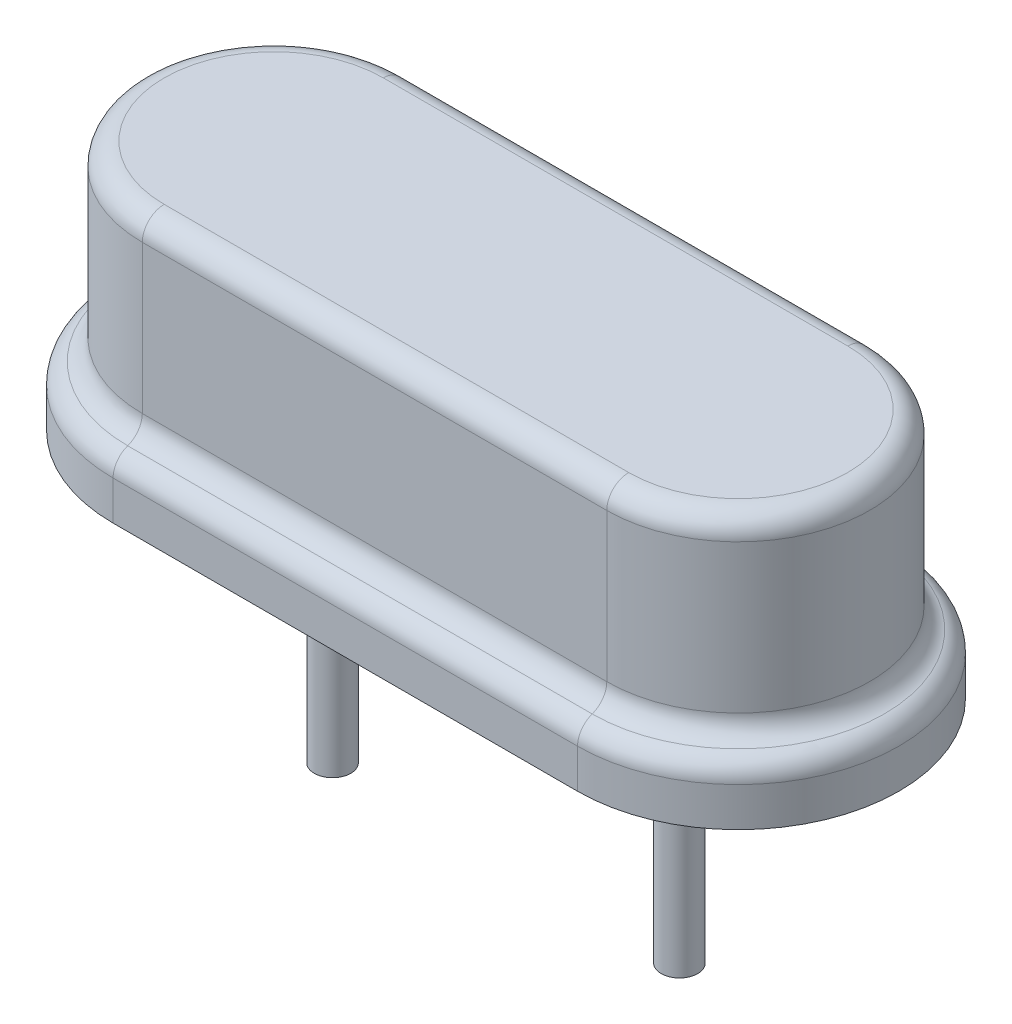
ISO-10303-21;
HEADER;
FILE_DESCRIPTION(('STEP AP214'),'2;1');
FILE_NAME('part.step','',(''),(''),'','','');
FILE_SCHEMA(('AUTOMOTIVE_DESIGN { 1 0 10303 214 1 1 1 1 }'));
ENDSEC;
DATA;
#1=APPLICATION_CONTEXT('core data for automotive mechanical design processes');
#2=APPLICATION_PROTOCOL_DEFINITION('international standard','automotive_design',2000,#1);
#3=PRODUCT_CONTEXT('',#1,'mechanical');
#4=PRODUCT('Part','Part','',(#3));
#5=PRODUCT_RELATED_PRODUCT_CATEGORY('part','',(#4));
#6=PRODUCT_DEFINITION_FORMATION('','',#4);
#7=PRODUCT_DEFINITION_CONTEXT('part definition',#1,'design');
#8=PRODUCT_DEFINITION('design','',#6,#7);
#9=PRODUCT_DEFINITION_SHAPE('','',#8);
#10=(LENGTH_UNIT() NAMED_UNIT(*) SI_UNIT(.MILLI.,.METRE.));
#11=(NAMED_UNIT(*) PLANE_ANGLE_UNIT() SI_UNIT($,.RADIAN.));
#12=(NAMED_UNIT(*) SI_UNIT($,.STERADIAN.) SOLID_ANGLE_UNIT());
#13=UNCERTAINTY_MEASURE_WITH_UNIT(LENGTH_MEASURE(1.E-05),#10,'distance_accuracy_value','');
#14=(GEOMETRIC_REPRESENTATION_CONTEXT(3) GLOBAL_UNCERTAINTY_ASSIGNED_CONTEXT((#13)) GLOBAL_UNIT_ASSIGNED_CONTEXT((#10,
#11,#12)) REPRESENTATION_CONTEXT('',''));
#15=CARTESIAN_POINT('',(0.,0.,0.));
#16=DIRECTION('',(0.,0.,1.));
#17=DIRECTION('',(1.,0.,0.));
#18=AXIS2_PLACEMENT_3D('',#15,#16,#17);
#19=CARTESIAN_POINT('',(0.,3.43,-2.2));
#20=DIRECTION('',(0.,-1.,0.));
#21=DIRECTION('',(0.,0.,-1.));
#22=AXIS2_PLACEMENT_3D('',#19,#20,#21);
#23=CYLINDRICAL_SURFACE('',#22,1.8);
#24=DIRECTION('',(0.,-1.,0.));
#25=VECTOR('',#24,1.);
#26=CARTESIAN_POINT('',(0.,3.43,-4.));
#27=LINE('',#26,#25);
#28=CARTESIAN_POINT('',(0.,3.13,-4.));
#29=VERTEX_POINT('',#28);
#30=CARTESIAN_POINT('',(0.,1.1,-4.));
#31=VERTEX_POINT('',#30);
#32=EDGE_CURVE('E139',#29,#31,#27,.T.);
#33=ORIENTED_EDGE('',*,*,#32,.T.);
#34=CARTESIAN_POINT('',(0.,1.1,-2.2));
#35=DIRECTION('',(0.,1.,0.));
#36=DIRECTION('',(0.,0.,1.));
#37=AXIS2_PLACEMENT_3D('',#34,#35,#36);
#38=CIRCLE('',#37,1.8);
#39=CARTESIAN_POINT('',(0.,1.1,-0.4));
#40=VERTEX_POINT('',#39);
#41=EDGE_CURVE('E183',#31,#40,#38,.T.);
#42=ORIENTED_EDGE('',*,*,#41,.T.);
#43=DIRECTION('',(0.,-1.,0.));
#44=VECTOR('',#43,1.);
#45=CARTESIAN_POINT('',(0.,3.43,-0.4));
#46=LINE('',#45,#44);
#47=CARTESIAN_POINT('',(0.,3.13,-0.4));
#48=VERTEX_POINT('',#47);
#49=EDGE_CURVE('E178',#48,#40,#46,.T.);
#50=ORIENTED_EDGE('',*,*,#49,.F.);
#51=CARTESIAN_POINT('',(0.,3.13,-2.2));
#52=DIRECTION('',(0.,1.,0.));
#53=DIRECTION('',(0.,0.,1.));
#54=AXIS2_PLACEMENT_3D('',#51,#52,#53);
#55=CIRCLE('',#54,1.8);
#56=EDGE_CURVE('E181',#48,#29,#55,.F.);
#57=ORIENTED_EDGE('',*,*,#56,.T.);
#58=EDGE_LOOP('',(#33,#42,#50,#57));
#59=FACE_BOUND('',#58,.T.);
#60=ADVANCED_FACE('F37',(#59),#23,.T.);
#61=CARTESIAN_POINT('',(0.,3.43,-0.4));
#62=DIRECTION('',(0.,0.,-1.));
#63=DIRECTION('',(-1.,0.,0.));
#64=AXIS2_PLACEMENT_3D('',#61,#62,#63);
#65=PLANE('',#64);
#66=ORIENTED_EDGE('',*,*,#49,.T.);
#67=DIRECTION('',(1.,0.,0.));
#68=VECTOR('',#67,1.);
#69=CARTESIAN_POINT('',(0.,1.1,-0.4));
#70=LINE('',#69,#68);
#71=CARTESIAN_POINT('',(6.36,1.1,-0.4));
#72=VERTEX_POINT('',#71);
#73=EDGE_CURVE('E197',#40,#72,#70,.T.);
#74=ORIENTED_EDGE('',*,*,#73,.T.);
#75=DIRECTION('',(0.,-1.,0.));
#76=VECTOR('',#75,1.);
#77=CARTESIAN_POINT('',(6.36,3.43,-0.4));
#78=LINE('',#77,#76);
#79=CARTESIAN_POINT('',(6.36,3.13,-0.4));
#80=VERTEX_POINT('',#79);
#81=EDGE_CURVE('E175',#80,#72,#78,.T.);
#82=ORIENTED_EDGE('',*,*,#81,.F.);
#83=DIRECTION('',(1.,0.,0.));
#84=VECTOR('',#83,1.);
#85=CARTESIAN_POINT('',(0.,3.13,-0.4));
#86=LINE('',#85,#84);
#87=EDGE_CURVE('E194',#80,#48,#86,.F.);
#88=ORIENTED_EDGE('',*,*,#87,.T.);
#89=EDGE_LOOP('',(#66,#74,#82,#88));
#90=FACE_BOUND('',#89,.T.);
#91=ADVANCED_FACE('F272',(#90),#65,.F.);
#92=CARTESIAN_POINT('',(6.36,3.43,-2.2));
#93=DIRECTION('',(0.,-1.,0.));
#94=DIRECTION('',(0.,0.,-1.));
#95=AXIS2_PLACEMENT_3D('',#92,#93,#94);
#96=CYLINDRICAL_SURFACE('',#95,1.8);
#97=ORIENTED_EDGE('',*,*,#81,.T.);
#98=CARTESIAN_POINT('',(6.36,1.1,-2.2));
#99=DIRECTION('',(0.,1.,0.));
#100=DIRECTION('',(0.,0.,1.));
#101=AXIS2_PLACEMENT_3D('',#98,#99,#100);
#102=CIRCLE('',#101,1.8);
#103=CARTESIAN_POINT('',(6.36,1.1,-4.));
#104=VERTEX_POINT('',#103);
#105=EDGE_CURVE('E192',#72,#104,#102,.T.);
#106=ORIENTED_EDGE('',*,*,#105,.T.);
#107=DIRECTION('',(0.,-1.,0.));
#108=VECTOR('',#107,1.);
#109=CARTESIAN_POINT('',(6.36,3.43,-4.));
#110=LINE('',#109,#108);
#111=CARTESIAN_POINT('',(6.36,3.13,-4.));
#112=VERTEX_POINT('',#111);
#113=EDGE_CURVE('E172',#112,#104,#110,.T.);
#114=ORIENTED_EDGE('',*,*,#113,.F.);
#115=CARTESIAN_POINT('',(6.36,3.13,-2.2));
#116=DIRECTION('',(0.,1.,0.));
#117=DIRECTION('',(0.,0.,1.));
#118=AXIS2_PLACEMENT_3D('',#115,#116,#117);
#119=CIRCLE('',#118,1.8);
#120=EDGE_CURVE('E190',#112,#80,#119,.F.);
#121=ORIENTED_EDGE('',*,*,#120,.T.);
#122=EDGE_LOOP('',(#97,#106,#114,#121));
#123=FACE_BOUND('',#122,.T.);
#124=ADVANCED_FACE('F278',(#123),#96,.T.);
#125=CARTESIAN_POINT('',(6.36,3.43,-4.));
#126=DIRECTION('',(0.,0.,1.));
#127=DIRECTION('',(1.,0.,0.));
#128=AXIS2_PLACEMENT_3D('',#125,#126,#127);
#129=PLANE('',#128);
#130=ORIENTED_EDGE('',*,*,#113,.T.);
#131=DIRECTION('',(-1.,0.,0.));
#132=VECTOR('',#131,1.);
#133=CARTESIAN_POINT('',(6.36,1.1,-4.));
#134=LINE('',#133,#132);
#135=EDGE_CURVE('E188',#104,#31,#134,.T.);
#136=ORIENTED_EDGE('',*,*,#135,.T.);
#137=ORIENTED_EDGE('',*,*,#32,.F.);
#138=DIRECTION('',(-1.,0.,0.));
#139=VECTOR('',#138,1.);
#140=CARTESIAN_POINT('',(6.36,3.13,-4.));
#141=LINE('',#140,#139);
#142=EDGE_CURVE('E186',#29,#112,#141,.F.);
#143=ORIENTED_EDGE('',*,*,#142,.T.);
#144=EDGE_LOOP('',(#130,#136,#137,#143));
#145=FACE_BOUND('',#144,.T.);
#146=ADVANCED_FACE('F342',(#145),#129,.F.);
#147=CARTESIAN_POINT('',(0.,3.43,-2.2));
#148=DIRECTION('',(0.,1.,0.));
#149=DIRECTION('',(0.,0.,1.));
#150=AXIS2_PLACEMENT_3D('',#147,#148,#149);
#151=PLANE('',#150);
#152=CARTESIAN_POINT('',(0.,3.43,-2.2));
#153=DIRECTION('',(0.,1.,0.));
#154=DIRECTION('',(0.,0.,1.));
#155=AXIS2_PLACEMENT_3D('',#152,#153,#154);
#156=CIRCLE('',#155,1.5);
#157=CARTESIAN_POINT('',(0.,3.43,-3.7));
#158=VERTEX_POINT('',#157);
#159=CARTESIAN_POINT('',(0.,3.43,-0.7));
#160=VERTEX_POINT('',#159);
#161=EDGE_CURVE('E200',#158,#160,#156,.T.);
#162=ORIENTED_EDGE('',*,*,#161,.T.);
#163=DIRECTION('',(1.,0.,0.));
#164=VECTOR('',#163,1.);
#165=CARTESIAN_POINT('',(6.36,3.43,-0.7));
#166=LINE('',#165,#164);
#167=CARTESIAN_POINT('',(6.36,3.43,-0.700000000000001));
#168=VERTEX_POINT('',#167);
#169=EDGE_CURVE('E206',#160,#168,#166,.T.);
#170=ORIENTED_EDGE('',*,*,#169,.T.);
#171=CARTESIAN_POINT('',(6.36,3.43,-2.2));
#172=DIRECTION('',(0.,1.,0.));
#173=DIRECTION('',(0.,0.,1.));
#174=AXIS2_PLACEMENT_3D('',#171,#172,#173);
#175=CIRCLE('',#174,1.5);
#176=CARTESIAN_POINT('',(6.36,3.43,-3.7));
#177=VERTEX_POINT('',#176);
#178=EDGE_CURVE('E204',#168,#177,#175,.T.);
#179=ORIENTED_EDGE('',*,*,#178,.T.);
#180=DIRECTION('',(-1.,0.,0.));
#181=VECTOR('',#180,1.);
#182=CARTESIAN_POINT('',(0.,3.43,-3.7));
#183=LINE('',#182,#181);
#184=EDGE_CURVE('E202',#177,#158,#183,.T.);
#185=ORIENTED_EDGE('',*,*,#184,.T.);
#186=EDGE_LOOP('',(#162,#170,#179,#185));
#187=FACE_BOUND('',#186,.T.);
#188=ADVANCED_FACE('F340',(#187),#151,.T.);
#189=CARTESIAN_POINT('',(0.,0.8,-2.2));
#190=DIRECTION('',(0.,-1.,0.));
#191=DIRECTION('',(0.,0.,-1.));
#192=AXIS2_PLACEMENT_3D('',#189,#190,#191);
#193=CYLINDRICAL_SURFACE('',#192,2.2);
#194=DIRECTION('',(0.,-1.,0.));
#195=VECTOR('',#194,1.);
#196=CARTESIAN_POINT('',(0.,0.8,0.));
#197=LINE('',#196,#195);
#198=CARTESIAN_POINT('',(0.,0.534314575050762,0.));
#199=VERTEX_POINT('',#198);
#200=CARTESIAN_POINT('',(0.,0.,0.));
#201=VERTEX_POINT('',#200);
#202=EDGE_CURVE('E128',#199,#201,#197,.T.);
#203=ORIENTED_EDGE('',*,*,#202,.F.);
#204=CARTESIAN_POINT('',(0.,0.534314575050762,-2.2));
#205=DIRECTION('',(0.,-1.,0.));
#206=DIRECTION('',(0.,0.,-1.));
#207=AXIS2_PLACEMENT_3D('',#204,#205,#206);
#208=CIRCLE('',#207,2.2);
#209=CARTESIAN_POINT('',(0.,0.534314575050762,-4.4));
#210=VERTEX_POINT('',#209);
#211=EDGE_CURVE('E229',#199,#210,#208,.T.);
#212=ORIENTED_EDGE('',*,*,#211,.T.);
#213=DIRECTION('',(0.,-1.,0.));
#214=VECTOR('',#213,1.);
#215=CARTESIAN_POINT('',(0.,0.8,-4.4));
#216=LINE('',#215,#214);
#217=CARTESIAN_POINT('',(0.,0.,-4.4));
#218=VERTEX_POINT('',#217);
#219=EDGE_CURVE('E152',#210,#218,#216,.T.);
#220=ORIENTED_EDGE('',*,*,#219,.T.);
#221=CARTESIAN_POINT('',(0.,0.,-2.2));
#222=DIRECTION('',(0.,1.,0.));
#223=DIRECTION('',(0.,0.,1.));
#224=AXIS2_PLACEMENT_3D('',#221,#222,#223);
#225=CIRCLE('',#224,2.2);
#226=EDGE_CURVE('E146',#218,#201,#225,.T.);
#227=ORIENTED_EDGE('',*,*,#226,.T.);
#228=EDGE_LOOP('',(#203,#212,#220,#227));
#229=FACE_BOUND('',#228,.T.);
#230=ADVANCED_FACE('F150',(#229),#193,.T.);
#231=CARTESIAN_POINT('',(0.,0.8,0.));
#232=DIRECTION('',(0.,0.,-1.));
#233=DIRECTION('',(-1.,0.,0.));
#234=AXIS2_PLACEMENT_3D('',#231,#232,#233);
#235=PLANE('',#234);
#236=DIRECTION('',(0.,-1.,0.));
#237=VECTOR('',#236,1.);
#238=CARTESIAN_POINT('',(6.36,0.8,0.));
#239=LINE('',#238,#237);
#240=CARTESIAN_POINT('',(6.36,0.534314575050762,0.));
#241=VERTEX_POINT('',#240);
#242=CARTESIAN_POINT('',(6.36,0.,0.));
#243=VERTEX_POINT('',#242);
#244=EDGE_CURVE('E140',#241,#243,#239,.T.);
#245=ORIENTED_EDGE('',*,*,#244,.F.);
#246=DIRECTION('',(1.,0.,0.));
#247=VECTOR('',#246,1.);
#248=CARTESIAN_POINT('',(0.,0.534314575050762,0.));
#249=LINE('',#248,#247);
#250=EDGE_CURVE('E134',#241,#199,#249,.F.);
#251=ORIENTED_EDGE('',*,*,#250,.T.);
#252=ORIENTED_EDGE('',*,*,#202,.T.);
#253=DIRECTION('',(1.,0.,0.));
#254=VECTOR('',#253,1.);
#255=CARTESIAN_POINT('',(0.,0.,0.));
#256=LINE('',#255,#254);
#257=EDGE_CURVE('E131',#201,#243,#256,.T.);
#258=ORIENTED_EDGE('',*,*,#257,.T.);
#259=EDGE_LOOP('',(#245,#251,#252,#258));
#260=FACE_BOUND('',#259,.T.);
#261=ADVANCED_FACE('F130',(#260),#235,.F.);
#262=CARTESIAN_POINT('',(6.36,0.8,-2.2));
#263=DIRECTION('',(0.,-1.,0.));
#264=DIRECTION('',(0.,0.,-1.));
#265=AXIS2_PLACEMENT_3D('',#262,#263,#264);
#266=CYLINDRICAL_SURFACE('',#265,2.2);
#267=DIRECTION('',(0.,-1.,0.));
#268=VECTOR('',#267,1.);
#269=CARTESIAN_POINT('',(6.36,0.8,-4.4));
#270=LINE('',#269,#268);
#271=CARTESIAN_POINT('',(6.36,0.534314575050762,-4.4));
#272=VERTEX_POINT('',#271);
#273=CARTESIAN_POINT('',(6.36,0.,-4.4));
#274=VERTEX_POINT('',#273);
#275=EDGE_CURVE('E167',#272,#274,#270,.T.);
#276=ORIENTED_EDGE('',*,*,#275,.F.);
#277=CARTESIAN_POINT('',(6.36,0.534314575050762,-2.2));
#278=DIRECTION('',(0.,-1.,0.));
#279=DIRECTION('',(0.,0.,-1.));
#280=AXIS2_PLACEMENT_3D('',#277,#278,#279);
#281=CIRCLE('',#280,2.2);
#282=EDGE_CURVE('E52',#272,#241,#281,.T.);
#283=ORIENTED_EDGE('',*,*,#282,.T.);
#284=ORIENTED_EDGE('',*,*,#244,.T.);
#285=CARTESIAN_POINT('',(6.36,0.,-2.2));
#286=DIRECTION('',(0.,1.,0.));
#287=DIRECTION('',(0.,0.,-1.));
#288=AXIS2_PLACEMENT_3D('',#285,#286,#287);
#289=CIRCLE('',#288,2.2);
#290=EDGE_CURVE('E148',#243,#274,#289,.T.);
#291=ORIENTED_EDGE('',*,*,#290,.T.);
#292=EDGE_LOOP('',(#276,#283,#284,#291));
#293=FACE_BOUND('',#292,.T.);
#294=ADVANCED_FACE('F265',(#293),#266,.T.);
#295=CARTESIAN_POINT('',(6.36,0.8,-4.4));
#296=DIRECTION('',(0.,0.,1.));
#297=DIRECTION('',(1.,0.,0.));
#298=AXIS2_PLACEMENT_3D('',#295,#296,#297);
#299=PLANE('',#298);
#300=ORIENTED_EDGE('',*,*,#219,.F.);
#301=DIRECTION('',(-1.,0.,0.));
#302=VECTOR('',#301,1.);
#303=CARTESIAN_POINT('',(6.36,0.534314575050762,-4.4));
#304=LINE('',#303,#302);
#305=EDGE_CURVE('E233',#210,#272,#304,.F.);
#306=ORIENTED_EDGE('',*,*,#305,.T.);
#307=ORIENTED_EDGE('',*,*,#275,.T.);
#308=DIRECTION('',(-1.,0.,0.));
#309=VECTOR('',#308,1.);
#310=CARTESIAN_POINT('',(6.36,0.,-4.4));
#311=LINE('',#310,#309);
#312=EDGE_CURVE('E164',#274,#218,#311,.T.);
#313=ORIENTED_EDGE('',*,*,#312,.T.);
#314=EDGE_LOOP('',(#300,#306,#307,#313));
#315=FACE_BOUND('',#314,.T.);
#316=ADVANCED_FACE('F255',(#315),#299,.F.);
#317=CARTESIAN_POINT('',(0.,0.,-2.2));
#318=DIRECTION('',(0.,1.,0.));
#319=DIRECTION('',(0.,0.,1.));
#320=AXIS2_PLACEMENT_3D('',#317,#318,#319);
#321=PLANE('',#320);
#322=CARTESIAN_POINT('',(5.555,0.,-2.2));
#323=DIRECTION('',(0.,1.,0.));
#324=DIRECTION('',(0.,0.,1.));
#325=AXIS2_PLACEMENT_3D('',#322,#323,#324);
#326=CIRCLE('',#325,0.25);
#327=CARTESIAN_POINT('',(5.555,0.,-1.95));
#328=VERTEX_POINT('',#327);
#329=EDGE_CURVE('E11',#328,#328,#326,.F.);
#330=ORIENTED_EDGE('',*,*,#329,.F.);
#331=EDGE_LOOP('',(#330));
#332=FACE_BOUND('',#331,.T.);
#333=CARTESIAN_POINT('',(0.805,0.,-2.2));
#334=DIRECTION('',(0.,1.,0.));
#335=DIRECTION('',(0.,0.,1.));
#336=AXIS2_PLACEMENT_3D('',#333,#334,#335);
#337=CIRCLE('',#336,0.25);
#338=CARTESIAN_POINT('',(0.805,0.,-1.95));
#339=VERTEX_POINT('',#338);
#340=EDGE_CURVE('E45',#339,#339,#337,.F.);
#341=ORIENTED_EDGE('',*,*,#340,.F.);
#342=EDGE_LOOP('',(#341));
#343=FACE_BOUND('',#342,.T.);
#344=ORIENTED_EDGE('',*,*,#226,.F.);
#345=ORIENTED_EDGE('',*,*,#312,.F.);
#346=ORIENTED_EDGE('',*,*,#290,.F.);
#347=ORIENTED_EDGE('',*,*,#257,.F.);
#348=EDGE_LOOP('',(#344,#345,#346,#347));
#349=FACE_BOUND('',#348,.T.);
#350=ADVANCED_FACE('F144',(#332,#343,#349),#321,.F.);
#351=CARTESIAN_POINT('',(6.36,1.1,-2.2));
#352=DIRECTION('',(0.,1.,0.));
#353=DIRECTION('',(0.,0.,1.));
#354=AXIS2_PLACEMENT_3D('',#351,#352,#353);
#355=TOROIDAL_SURFACE('',#354,2.1,0.3);
#356=CARTESIAN_POINT('',(6.36,1.1,-0.100000000000001));
#357=DIRECTION('',(1.,0.,0.));
#358=DIRECTION('',(0.,0.,-1.));
#359=AXIS2_PLACEMENT_3D('',#356,#357,#358);
#360=CIRCLE('',#359,0.3);
#361=CARTESIAN_POINT('',(6.36,0.817157287525381,-0.2));
#362=VERTEX_POINT('',#361);
#363=EDGE_CURVE('E157',#362,#72,#360,.T.);
#364=ORIENTED_EDGE('',*,*,#363,.F.);
#365=CARTESIAN_POINT('',(6.36,0.817157287525339,-2.2));
#366=DIRECTION('',(0.,1.,0.));
#367=DIRECTION('',(0.,0.,1.));
#368=AXIS2_PLACEMENT_3D('',#365,#366,#367);
#369=CIRCLE('',#368,1.99999999999998);
#370=CARTESIAN_POINT('',(6.36,0.817157287525339,-4.20000000000005));
#371=VERTEX_POINT('',#370);
#372=EDGE_CURVE('E235',#362,#371,#369,.T.);
#373=ORIENTED_EDGE('',*,*,#372,.T.);
#374=CARTESIAN_POINT('',(6.36,1.1,-4.3));
#375=DIRECTION('',(1.,0.,0.));
#376=DIRECTION('',(0.,0.,-1.));
#377=AXIS2_PLACEMENT_3D('',#374,#375,#376);
#378=CIRCLE('',#377,0.3);
#379=EDGE_CURVE('E154',#104,#371,#378,.T.);
#380=ORIENTED_EDGE('',*,*,#379,.F.);
#381=ORIENTED_EDGE('',*,*,#105,.F.);
#382=EDGE_LOOP('',(#364,#373,#380,#381));
#383=FACE_BOUND('',#382,.T.);
#384=ADVANCED_FACE('F254',(#383),#355,.F.);
#385=CARTESIAN_POINT('',(6.36,1.1,-4.3));
#386=DIRECTION('',(-1.,0.,0.));
#387=DIRECTION('',(0.,0.,1.));
#388=AXIS2_PLACEMENT_3D('',#385,#386,#387);
#389=CYLINDRICAL_SURFACE('',#388,0.3);
#390=ORIENTED_EDGE('',*,*,#379,.T.);
#391=DIRECTION('',(-1.,0.,0.));
#392=VECTOR('',#391,1.);
#393=CARTESIAN_POINT('',(6.36,0.817157287525381,-4.2));
#394=LINE('',#393,#392);
#395=CARTESIAN_POINT('',(0.,0.817157287525381,-4.2));
#396=VERTEX_POINT('',#395);
#397=EDGE_CURVE('E231',#371,#396,#394,.T.);
#398=ORIENTED_EDGE('',*,*,#397,.T.);
#399=CARTESIAN_POINT('',(0.,1.1,-4.3));
#400=DIRECTION('',(1.,0.,0.));
#401=DIRECTION('',(0.,1.,0.));
#402=AXIS2_PLACEMENT_3D('',#399,#400,#401);
#403=CIRCLE('',#402,0.3);
#404=EDGE_CURVE('E212',#31,#396,#403,.T.);
#405=ORIENTED_EDGE('',*,*,#404,.F.);
#406=ORIENTED_EDGE('',*,*,#135,.F.);
#407=EDGE_LOOP('',(#390,#398,#405,#406));
#408=FACE_BOUND('',#407,.T.);
#409=ADVANCED_FACE('F262',(#408),#389,.F.);
#410=CARTESIAN_POINT('',(0.,1.1,-0.1));
#411=DIRECTION('',(1.,0.,0.));
#412=DIRECTION('',(0.,0.,-1.));
#413=AXIS2_PLACEMENT_3D('',#410,#411,#412);
#414=CYLINDRICAL_SURFACE('',#413,0.3);
#415=CARTESIAN_POINT('',(0.,1.1,-0.1));
#416=DIRECTION('',(1.,0.,0.));
#417=DIRECTION('',(0.,0.,-1.));
#418=AXIS2_PLACEMENT_3D('',#415,#416,#417);
#419=CIRCLE('',#418,0.3);
#420=CARTESIAN_POINT('',(0.,0.817157287525381,-0.2));
#421=VERTEX_POINT('',#420);
#422=EDGE_CURVE('E210',#421,#40,#419,.T.);
#423=ORIENTED_EDGE('',*,*,#422,.F.);
#424=DIRECTION('',(1.,0.,0.));
#425=VECTOR('',#424,1.);
#426=CARTESIAN_POINT('',(0.,0.817157287525381,-0.2));
#427=LINE('',#426,#425);
#428=EDGE_CURVE('E60',#421,#362,#427,.T.);
#429=ORIENTED_EDGE('',*,*,#428,.T.);
#430=ORIENTED_EDGE('',*,*,#363,.T.);
#431=ORIENTED_EDGE('',*,*,#73,.F.);
#432=EDGE_LOOP('',(#423,#429,#430,#431));
#433=FACE_BOUND('',#432,.T.);
#434=ADVANCED_FACE('F287',(#433),#414,.F.);
#435=CARTESIAN_POINT('',(0.,1.1,-2.2));
#436=DIRECTION('',(0.,1.,0.));
#437=DIRECTION('',(0.,0.,1.));
#438=AXIS2_PLACEMENT_3D('',#435,#436,#437);
#439=TOROIDAL_SURFACE('',#438,2.1,0.3);
#440=ORIENTED_EDGE('',*,*,#404,.T.);
#441=CARTESIAN_POINT('',(0.,0.817157287525392,-2.2));
#442=DIRECTION('',(0.,1.,0.));
#443=DIRECTION('',(0.,0.,1.));
#444=AXIS2_PLACEMENT_3D('',#441,#442,#443);
#445=CIRCLE('',#444,2.);
#446=EDGE_CURVE('E209',#396,#421,#445,.T.);
#447=ORIENTED_EDGE('',*,*,#446,.T.);
#448=ORIENTED_EDGE('',*,*,#422,.T.);
#449=ORIENTED_EDGE('',*,*,#41,.F.);
#450=EDGE_LOOP('',(#440,#447,#448,#449));
#451=FACE_BOUND('',#450,.T.);
#452=ADVANCED_FACE('F283',(#451),#439,.F.);
#453=CARTESIAN_POINT('',(0.,3.13,-3.7));
#454=DIRECTION('',(1.,0.,0.));
#455=DIRECTION('',(0.,0.,-1.));
#456=AXIS2_PLACEMENT_3D('',#453,#454,#455);
#457=CYLINDRICAL_SURFACE('',#456,0.3);
#458=CARTESIAN_POINT('',(6.36,3.13,-3.7));
#459=DIRECTION('',(1.,0.,0.));
#460=DIRECTION('',(0.,0.,-1.));
#461=AXIS2_PLACEMENT_3D('',#458,#459,#460);
#462=CIRCLE('',#461,0.3);
#463=EDGE_CURVE('E222',#112,#177,#462,.T.);
#464=ORIENTED_EDGE('',*,*,#463,.F.);
#465=ORIENTED_EDGE('',*,*,#142,.F.);
#466=CARTESIAN_POINT('',(0.,3.13,-3.7));
#467=DIRECTION('',(-1.,0.,0.));
#468=DIRECTION('',(0.,0.,1.));
#469=AXIS2_PLACEMENT_3D('',#466,#467,#468);
#470=CIRCLE('',#469,0.3);
#471=EDGE_CURVE('E213',#158,#29,#470,.T.);
#472=ORIENTED_EDGE('',*,*,#471,.F.);
#473=ORIENTED_EDGE('',*,*,#184,.F.);
#474=EDGE_LOOP('',(#464,#465,#472,#473));
#475=FACE_BOUND('',#474,.T.);
#476=ADVANCED_FACE('F286',(#475),#457,.T.);
#477=CARTESIAN_POINT('',(0.,3.13,-2.2));
#478=DIRECTION('',(0.,1.,0.));
#479=DIRECTION('',(0.,0.,1.));
#480=AXIS2_PLACEMENT_3D('',#477,#478,#479);
#481=TOROIDAL_SURFACE('',#480,1.5,0.3);
#482=ORIENTED_EDGE('',*,*,#471,.T.);
#483=ORIENTED_EDGE('',*,*,#56,.F.);
#484=CARTESIAN_POINT('',(0.,3.13,-0.7));
#485=DIRECTION('',(1.,0.,0.));
#486=DIRECTION('',(0.,0.,-1.));
#487=AXIS2_PLACEMENT_3D('',#484,#485,#486);
#488=CIRCLE('',#487,0.3);
#489=EDGE_CURVE('E219',#160,#48,#488,.T.);
#490=ORIENTED_EDGE('',*,*,#489,.F.);
#491=ORIENTED_EDGE('',*,*,#161,.F.);
#492=EDGE_LOOP('',(#482,#483,#490,#491));
#493=FACE_BOUND('',#492,.T.);
#494=ADVANCED_FACE('F301',(#493),#481,.T.);
#495=CARTESIAN_POINT('',(6.36,3.13,-2.2));
#496=DIRECTION('',(0.,1.,0.));
#497=DIRECTION('',(0.,0.,1.));
#498=AXIS2_PLACEMENT_3D('',#495,#496,#497);
#499=TOROIDAL_SURFACE('',#498,1.5,0.3);
#500=ORIENTED_EDGE('',*,*,#463,.T.);
#501=ORIENTED_EDGE('',*,*,#178,.F.);
#502=CARTESIAN_POINT('',(6.36,3.13,-0.700000000000001));
#503=DIRECTION('',(-1.,0.,0.));
#504=DIRECTION('',(0.,0.,1.));
#505=AXIS2_PLACEMENT_3D('',#502,#503,#504);
#506=CIRCLE('',#505,0.3);
#507=EDGE_CURVE('E217',#80,#168,#506,.T.);
#508=ORIENTED_EDGE('',*,*,#507,.F.);
#509=ORIENTED_EDGE('',*,*,#120,.F.);
#510=EDGE_LOOP('',(#500,#501,#508,#509));
#511=FACE_BOUND('',#510,.T.);
#512=ADVANCED_FACE('F297',(#511),#499,.T.);
#513=CARTESIAN_POINT('',(0.,3.13,-0.7));
#514=DIRECTION('',(-1.,0.,0.));
#515=DIRECTION('',(0.,0.,1.));
#516=AXIS2_PLACEMENT_3D('',#513,#514,#515);
#517=CYLINDRICAL_SURFACE('',#516,0.3);
#518=ORIENTED_EDGE('',*,*,#489,.T.);
#519=ORIENTED_EDGE('',*,*,#87,.F.);
#520=ORIENTED_EDGE('',*,*,#507,.T.);
#521=ORIENTED_EDGE('',*,*,#169,.F.);
#522=EDGE_LOOP('',(#518,#519,#520,#521));
#523=FACE_BOUND('',#522,.T.);
#524=ADVANCED_FACE('F294',(#523),#517,.T.);
#525=CARTESIAN_POINT('',(6.36,0.534314575050762,-2.2));
#526=DIRECTION('',(0.,-1.,0.));
#527=DIRECTION('',(0.,0.,-1.));
#528=AXIS2_PLACEMENT_3D('',#525,#526,#527);
#529=TOROIDAL_SURFACE('',#528,1.9,0.3);
#530=CARTESIAN_POINT('',(6.36,0.534314575050762,-0.300000000000001));
#531=DIRECTION('',(-1.,0.,0.));
#532=DIRECTION('',(0.,0.,1.));
#533=AXIS2_PLACEMENT_3D('',#530,#531,#532);
#534=CIRCLE('',#533,0.3);
#535=EDGE_CURVE('E244',#241,#362,#534,.T.);
#536=ORIENTED_EDGE('',*,*,#535,.F.);
#537=ORIENTED_EDGE('',*,*,#282,.F.);
#538=CARTESIAN_POINT('',(6.36,0.534314575050762,-4.1));
#539=DIRECTION('',(-1.,0.,0.));
#540=DIRECTION('',(0.,0.,1.));
#541=AXIS2_PLACEMENT_3D('',#538,#539,#540);
#542=CIRCLE('',#541,0.3);
#543=EDGE_CURVE('E220',#371,#272,#542,.T.);
#544=ORIENTED_EDGE('',*,*,#543,.F.);
#545=ORIENTED_EDGE('',*,*,#372,.F.);
#546=EDGE_LOOP('',(#536,#537,#544,#545));
#547=FACE_BOUND('',#546,.T.);
#548=ADVANCED_FACE('F39',(#547),#529,.T.);
#549=CARTESIAN_POINT('',(6.36,0.534314575050762,-4.1));
#550=DIRECTION('',(-1.,0.,0.));
#551=DIRECTION('',(0.,0.,1.));
#552=AXIS2_PLACEMENT_3D('',#549,#550,#551);
#553=CYLINDRICAL_SURFACE('',#552,0.3);
#554=ORIENTED_EDGE('',*,*,#543,.T.);
#555=ORIENTED_EDGE('',*,*,#305,.F.);
#556=CARTESIAN_POINT('',(0.,0.534314575050762,-4.1));
#557=DIRECTION('',(-1.,0.,0.));
#558=DIRECTION('',(0.,0.,1.));
#559=AXIS2_PLACEMENT_3D('',#556,#557,#558);
#560=CIRCLE('',#559,0.3);
#561=EDGE_CURVE('E242',#396,#210,#560,.T.);
#562=ORIENTED_EDGE('',*,*,#561,.F.);
#563=ORIENTED_EDGE('',*,*,#397,.F.);
#564=EDGE_LOOP('',(#554,#555,#562,#563));
#565=FACE_BOUND('',#564,.T.);
#566=ADVANCED_FACE('F315',(#565),#553,.T.);
#567=CARTESIAN_POINT('',(0.,0.534314575050762,-0.3));
#568=DIRECTION('',(1.,0.,0.));
#569=DIRECTION('',(0.,0.,-1.));
#570=AXIS2_PLACEMENT_3D('',#567,#568,#569);
#571=CYLINDRICAL_SURFACE('',#570,0.3);
#572=ORIENTED_EDGE('',*,*,#535,.T.);
#573=ORIENTED_EDGE('',*,*,#428,.F.);
#574=CARTESIAN_POINT('',(0.,0.534314575050762,-0.3));
#575=DIRECTION('',(-1.,0.,0.));
#576=DIRECTION('',(0.,0.,1.));
#577=AXIS2_PLACEMENT_3D('',#574,#575,#576);
#578=CIRCLE('',#577,0.3);
#579=EDGE_CURVE('E240',#199,#421,#578,.T.);
#580=ORIENTED_EDGE('',*,*,#579,.F.);
#581=ORIENTED_EDGE('',*,*,#250,.F.);
#582=EDGE_LOOP('',(#572,#573,#580,#581));
#583=FACE_BOUND('',#582,.T.);
#584=ADVANCED_FACE('F312',(#583),#571,.T.);
#585=CARTESIAN_POINT('',(0.,0.534314575050762,-2.2));
#586=DIRECTION('',(0.,-1.,0.));
#587=DIRECTION('',(0.,0.,-1.));
#588=AXIS2_PLACEMENT_3D('',#585,#586,#587);
#589=TOROIDAL_SURFACE('',#588,1.9,0.3);
#590=ORIENTED_EDGE('',*,*,#561,.T.);
#591=ORIENTED_EDGE('',*,*,#211,.F.);
#592=ORIENTED_EDGE('',*,*,#579,.T.);
#593=ORIENTED_EDGE('',*,*,#446,.F.);
#594=EDGE_LOOP('',(#590,#591,#592,#593));
#595=FACE_BOUND('',#594,.T.);
#596=ADVANCED_FACE('F309',(#595),#589,.T.);
#597=CARTESIAN_POINT('',(0.805,-3.54,-2.2));
#598=DIRECTION('',(0.,1.,0.));
#599=DIRECTION('',(0.,0.,1.));
#600=AXIS2_PLACEMENT_3D('',#597,#598,#599);
#601=CYLINDRICAL_SURFACE('',#600,0.25);
#602=CARTESIAN_POINT('',(0.805,-3.54,-2.2));
#603=DIRECTION('',(0.,-1.,0.));
#604=DIRECTION('',(0.,0.,-1.));
#605=AXIS2_PLACEMENT_3D('',#602,#603,#604);
#606=CIRCLE('',#605,0.25);
#607=CARTESIAN_POINT('',(0.805,-3.54,-2.45));
#608=VERTEX_POINT('',#607);
#609=EDGE_CURVE('E160',#608,#608,#606,.T.);
#610=ORIENTED_EDGE('',*,*,#609,.F.);
#611=EDGE_LOOP('',(#610));
#612=FACE_BOUND('',#611,.T.);
#613=ORIENTED_EDGE('',*,*,#340,.T.);
#614=EDGE_LOOP('',(#613));
#615=FACE_BOUND('',#614,.T.);
#616=ADVANCED_FACE('F251',(#612,#615),#601,.T.);
#617=CARTESIAN_POINT('',(0.805,-3.54,-2.2));
#618=DIRECTION('',(0.,-1.,0.));
#619=DIRECTION('',(0.,0.,-1.));
#620=AXIS2_PLACEMENT_3D('',#617,#618,#619);
#621=PLANE('',#620);
#622=ORIENTED_EDGE('',*,*,#609,.T.);
#623=EDGE_LOOP('',(#622));
#624=FACE_BOUND('',#623,.T.);
#625=ADVANCED_FACE('F490',(#624),#621,.T.);
#626=CARTESIAN_POINT('',(5.555,-3.54,-2.2));
#627=DIRECTION('',(0.,1.,0.));
#628=DIRECTION('',(0.,0.,1.));
#629=AXIS2_PLACEMENT_3D('',#626,#627,#628);
#630=CYLINDRICAL_SURFACE('',#629,0.25);
#631=CARTESIAN_POINT('',(5.555,-3.54,-2.2));
#632=DIRECTION('',(0.,-1.,0.));
#633=DIRECTION('',(0.,0.,-1.));
#634=AXIS2_PLACEMENT_3D('',#631,#632,#633);
#635=CIRCLE('',#634,0.25);
#636=CARTESIAN_POINT('',(5.555,-3.54,-2.45));
#637=VERTEX_POINT('',#636);
#638=EDGE_CURVE('E525',#637,#637,#635,.T.);
#639=ORIENTED_EDGE('',*,*,#638,.F.);
#640=EDGE_LOOP('',(#639));
#641=FACE_BOUND('',#640,.T.);
#642=ORIENTED_EDGE('',*,*,#329,.T.);
#643=EDGE_LOOP('',(#642));
#644=FACE_BOUND('',#643,.T.);
#645=ADVANCED_FACE('F499',(#641,#644),#630,.T.);
#646=CARTESIAN_POINT('',(5.555,-3.54,-2.2));
#647=DIRECTION('',(0.,-1.,0.));
#648=DIRECTION('',(0.,0.,-1.));
#649=AXIS2_PLACEMENT_3D('',#646,#647,#648);
#650=PLANE('',#649);
#651=ORIENTED_EDGE('',*,*,#638,.T.);
#652=EDGE_LOOP('',(#651));
#653=FACE_BOUND('',#652,.T.);
#654=ADVANCED_FACE('F509',(#653),#650,.T.);
#655=CLOSED_SHELL('',(#60,#91,#124,#146,#188,#230,#261,#294,#316,#350,#384,#409,#434,#452,#476,
#494,#512,#524,#548,#566,#584,#596,#616,#625,#645,#654));
#656=MANIFOLD_SOLID_BREP('B2',#655);
#657=ADVANCED_BREP_SHAPE_REPRESENTATION('',(#18,#656),#14);
#658=SHAPE_DEFINITION_REPRESENTATION(#9,#657);
ENDSEC;
END-ISO-10303-21;
